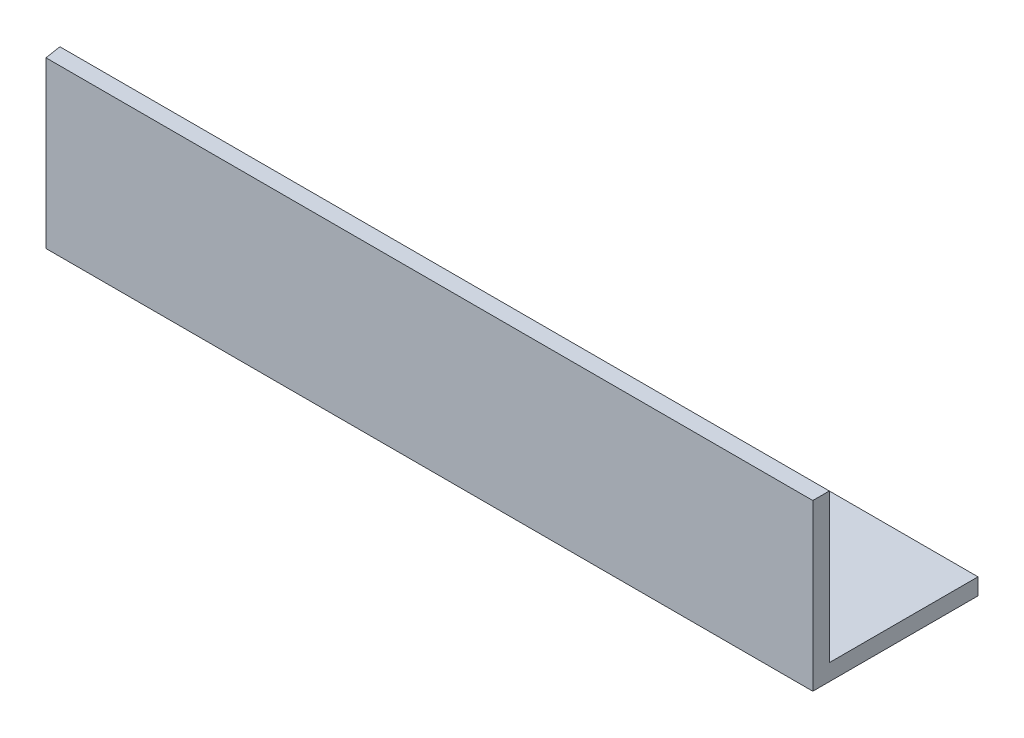
ISO-10303-21;
HEADER;
FILE_DESCRIPTION(('STEP AP214'),'2;1');
FILE_NAME('part.step','',(''),(''),'','','');
FILE_SCHEMA(('AUTOMOTIVE_DESIGN { 1 0 10303 214 1 1 1 1 }'));
ENDSEC;
DATA;
#1=APPLICATION_CONTEXT('core data for automotive mechanical design processes');
#2=APPLICATION_PROTOCOL_DEFINITION('international standard','automotive_design',2000,#1);
#3=PRODUCT_CONTEXT('',#1,'mechanical');
#4=PRODUCT('Part','Part','',(#3));
#5=PRODUCT_RELATED_PRODUCT_CATEGORY('part','',(#4));
#6=PRODUCT_DEFINITION_FORMATION('','',#4);
#7=PRODUCT_DEFINITION_CONTEXT('part definition',#1,'design');
#8=PRODUCT_DEFINITION('design','',#6,#7);
#9=PRODUCT_DEFINITION_SHAPE('','',#8);
#10=(LENGTH_UNIT() NAMED_UNIT(*) SI_UNIT(.MILLI.,.METRE.));
#11=(NAMED_UNIT(*) PLANE_ANGLE_UNIT() SI_UNIT($,.RADIAN.));
#12=(NAMED_UNIT(*) SI_UNIT($,.STERADIAN.) SOLID_ANGLE_UNIT());
#13=UNCERTAINTY_MEASURE_WITH_UNIT(LENGTH_MEASURE(1.E-05),#10,'distance_accuracy_value','');
#14=(GEOMETRIC_REPRESENTATION_CONTEXT(3) GLOBAL_UNCERTAINTY_ASSIGNED_CONTEXT((#13)) GLOBAL_UNIT_ASSIGNED_CONTEXT((#10,
#11,#12)) REPRESENTATION_CONTEXT('',''));
#15=CARTESIAN_POINT('',(0.,0.,0.));
#16=DIRECTION('',(0.,0.,1.));
#17=DIRECTION('',(1.,0.,0.));
#18=AXIS2_PLACEMENT_3D('',#15,#16,#17);
#19=CARTESIAN_POINT('',(96.,20.,0.));
#20=DIRECTION('',(0.,-1.,0.));
#21=DIRECTION('',(0.,0.,-1.));
#22=AXIS2_PLACEMENT_3D('',#19,#20,#21);
#23=PLANE('',#22);
#24=DIRECTION('',(-0.156434465040231,0.,-0.987688340595138));
#25=VECTOR('',#24,1.);
#26=CARTESIAN_POINT('',(0.,20.,-20.));
#27=LINE('',#26,#25);
#28=CARTESIAN_POINT('',(3.16768880649074,20.,0.));
#29=VERTEX_POINT('',#28);
#30=CARTESIAN_POINT('',(2.85091992584166,20.,-2.));
#31=VERTEX_POINT('',#30);
#32=EDGE_CURVE('E90',#29,#31,#27,.T.);
#33=ORIENTED_EDGE('',*,*,#32,.F.);
#34=DIRECTION('',(-1.,0.,0.));
#35=VECTOR('',#34,1.);
#36=CARTESIAN_POINT('',(96.,20.,0.));
#37=LINE('',#36,#35);
#38=CARTESIAN_POINT('',(96.,20.,0.));
#39=VERTEX_POINT('',#38);
#40=EDGE_CURVE('E11',#39,#29,#37,.T.);
#41=ORIENTED_EDGE('',*,*,#40,.F.);
#42=DIRECTION('',(0.,0.,1.));
#43=VECTOR('',#42,1.);
#44=CARTESIAN_POINT('',(96.,20.,0.));
#45=LINE('',#44,#43);
#46=CARTESIAN_POINT('',(96.,20.,-2.));
#47=VERTEX_POINT('',#46);
#48=EDGE_CURVE('E109',#47,#39,#45,.T.);
#49=ORIENTED_EDGE('',*,*,#48,.F.);
#50=DIRECTION('',(-1.,0.,0.));
#51=VECTOR('',#50,1.);
#52=CARTESIAN_POINT('',(96.,20.,-2.));
#53=LINE('',#52,#51);
#54=EDGE_CURVE('E103',#47,#31,#53,.T.);
#55=ORIENTED_EDGE('',*,*,#54,.T.);
#56=EDGE_LOOP('',(#33,#41,#49,#55));
#57=FACE_BOUND('',#56,.T.);
#58=ADVANCED_FACE('F39',(#57),#23,.F.);
#59=CARTESIAN_POINT('',(96.,20.,0.));
#60=DIRECTION('',(0.,0.,-1.));
#61=DIRECTION('',(-1.,0.,0.));
#62=AXIS2_PLACEMENT_3D('',#59,#60,#61);
#63=PLANE('',#62);
#64=DIRECTION('',(0.,-1.,0.));
#65=VECTOR('',#64,1.);
#66=CARTESIAN_POINT('',(3.16768880649074,20.,0.));
#67=LINE('',#66,#65);
#68=CARTESIAN_POINT('',(3.16768880649074,0.,0.));
#69=VERTEX_POINT('',#68);
#70=EDGE_CURVE('E86',#29,#69,#67,.T.);
#71=ORIENTED_EDGE('',*,*,#70,.T.);
#72=DIRECTION('',(-1.,0.,0.));
#73=VECTOR('',#72,1.);
#74=CARTESIAN_POINT('',(96.,0.,0.));
#75=LINE('',#74,#73);
#76=CARTESIAN_POINT('',(96.,0.,0.));
#77=VERTEX_POINT('',#76);
#78=EDGE_CURVE('E47',#77,#69,#75,.T.);
#79=ORIENTED_EDGE('',*,*,#78,.F.);
#80=DIRECTION('',(0.,-1.,0.));
#81=VECTOR('',#80,1.);
#82=CARTESIAN_POINT('',(96.,20.,0.));
#83=LINE('',#82,#81);
#84=EDGE_CURVE('E106',#39,#77,#83,.T.);
#85=ORIENTED_EDGE('',*,*,#84,.F.);
#86=ORIENTED_EDGE('',*,*,#40,.T.);
#87=EDGE_LOOP('',(#71,#79,#85,#86));
#88=FACE_BOUND('',#87,.T.);
#89=ADVANCED_FACE('F105',(#88),#63,.F.);
#90=CARTESIAN_POINT('',(96.,0.,0.));
#91=DIRECTION('',(0.,1.,0.));
#92=DIRECTION('',(0.,0.,1.));
#93=AXIS2_PLACEMENT_3D('',#90,#91,#92);
#94=PLANE('',#93);
#95=DIRECTION('',(-0.156434465040231,0.,-0.987688340595138));
#96=VECTOR('',#95,1.);
#97=CARTESIAN_POINT('',(0.,0.,-20.));
#98=LINE('',#97,#96);
#99=CARTESIAN_POINT('',(0.,0.,-20.));
#100=VERTEX_POINT('',#99);
#101=EDGE_CURVE('E93',#69,#100,#98,.T.);
#102=ORIENTED_EDGE('',*,*,#101,.T.);
#103=DIRECTION('',(-1.,0.,0.));
#104=VECTOR('',#103,1.);
#105=CARTESIAN_POINT('',(96.,0.,-20.));
#106=LINE('',#105,#104);
#107=CARTESIAN_POINT('',(96.,0.,-20.));
#108=VERTEX_POINT('',#107);
#109=EDGE_CURVE('E133',#108,#100,#106,.T.);
#110=ORIENTED_EDGE('',*,*,#109,.F.);
#111=DIRECTION('',(0.,0.,-1.));
#112=VECTOR('',#111,1.);
#113=CARTESIAN_POINT('',(96.,0.,0.));
#114=LINE('',#113,#112);
#115=EDGE_CURVE('E108',#77,#108,#114,.T.);
#116=ORIENTED_EDGE('',*,*,#115,.F.);
#117=ORIENTED_EDGE('',*,*,#78,.T.);
#118=EDGE_LOOP('',(#102,#110,#116,#117));
#119=FACE_BOUND('',#118,.T.);
#120=ADVANCED_FACE('F136',(#119),#94,.F.);
#121=CARTESIAN_POINT('',(96.,2.,-20.));
#122=DIRECTION('',(0.,-1.,0.));
#123=DIRECTION('',(0.,0.,-1.));
#124=AXIS2_PLACEMENT_3D('',#121,#122,#123);
#125=PLANE('',#124);
#126=DIRECTION('',(-0.156434465040231,0.,-0.987688340595138));
#127=VECTOR('',#126,1.);
#128=CARTESIAN_POINT('',(2.34928721783265,2.,-5.16718427000247));
#129=LINE('',#128,#127);
#130=CARTESIAN_POINT('',(2.85091992584167,2.,-2.));
#131=VERTEX_POINT('',#130);
#132=CARTESIAN_POINT('',(0.,2.,-20.));
#133=VERTEX_POINT('',#132);
#134=EDGE_CURVE('E115',#131,#133,#129,.T.);
#135=ORIENTED_EDGE('',*,*,#134,.F.);
#136=DIRECTION('',(-1.,0.,0.));
#137=VECTOR('',#136,1.);
#138=CARTESIAN_POINT('',(96.,2.,-2.));
#139=LINE('',#138,#137);
#140=CARTESIAN_POINT('',(96.,2.,-2.));
#141=VERTEX_POINT('',#140);
#142=EDGE_CURVE('E127',#141,#131,#139,.T.);
#143=ORIENTED_EDGE('',*,*,#142,.F.);
#144=DIRECTION('',(0.,0.,1.));
#145=VECTOR('',#144,1.);
#146=CARTESIAN_POINT('',(96.,2.,-20.));
#147=LINE('',#146,#145);
#148=CARTESIAN_POINT('',(96.,2.,-20.));
#149=VERTEX_POINT('',#148);
#150=EDGE_CURVE('E123',#149,#141,#147,.T.);
#151=ORIENTED_EDGE('',*,*,#150,.F.);
#152=DIRECTION('',(-1.,0.,0.));
#153=VECTOR('',#152,1.);
#154=CARTESIAN_POINT('',(96.,2.,-20.));
#155=LINE('',#154,#153);
#156=EDGE_CURVE('E130',#149,#133,#155,.T.);
#157=ORIENTED_EDGE('',*,*,#156,.T.);
#158=EDGE_LOOP('',(#135,#143,#151,#157));
#159=FACE_BOUND('',#158,.T.);
#160=ADVANCED_FACE('F146',(#159),#125,.F.);
#161=CARTESIAN_POINT('',(96.,2.,-2.));
#162=DIRECTION('',(0.,0.,1.));
#163=DIRECTION('',(0.,-1.,0.));
#164=AXIS2_PLACEMENT_3D('',#161,#162,#163);
#165=PLANE('',#164);
#166=DIRECTION('',(0.,-1.,0.));
#167=VECTOR('',#166,1.);
#168=CARTESIAN_POINT('',(2.85091992584167,2.,-2.));
#169=LINE('',#168,#167);
#170=EDGE_CURVE('E97',#31,#131,#169,.T.);
#171=ORIENTED_EDGE('',*,*,#170,.F.);
#172=ORIENTED_EDGE('',*,*,#54,.F.);
#173=DIRECTION('',(0.,1.,0.));
#174=VECTOR('',#173,1.);
#175=CARTESIAN_POINT('',(96.,2.,-2.));
#176=LINE('',#175,#174);
#177=EDGE_CURVE('E54',#141,#47,#176,.T.);
#178=ORIENTED_EDGE('',*,*,#177,.F.);
#179=ORIENTED_EDGE('',*,*,#142,.T.);
#180=EDGE_LOOP('',(#171,#172,#178,#179));
#181=FACE_BOUND('',#180,.T.);
#182=ADVANCED_FACE('F148',(#181),#165,.F.);
#183=CARTESIAN_POINT('',(96.,0.,-20.));
#184=DIRECTION('',(0.,0.,1.));
#185=DIRECTION('',(1.,0.,0.));
#186=AXIS2_PLACEMENT_3D('',#183,#184,#185);
#187=PLANE('',#186);
#188=DIRECTION('',(0.,1.,0.));
#189=VECTOR('',#188,1.);
#190=CARTESIAN_POINT('',(0.,0.,-20.));
#191=LINE('',#190,#189);
#192=EDGE_CURVE('E112',#100,#133,#191,.T.);
#193=ORIENTED_EDGE('',*,*,#192,.T.);
#194=ORIENTED_EDGE('',*,*,#156,.F.);
#195=DIRECTION('',(0.,1.,0.));
#196=VECTOR('',#195,1.);
#197=CARTESIAN_POINT('',(96.,0.,-20.));
#198=LINE('',#197,#196);
#199=EDGE_CURVE('E121',#108,#149,#198,.T.);
#200=ORIENTED_EDGE('',*,*,#199,.F.);
#201=ORIENTED_EDGE('',*,*,#109,.T.);
#202=EDGE_LOOP('',(#193,#194,#200,#201));
#203=FACE_BOUND('',#202,.T.);
#204=ADVANCED_FACE('F143',(#203),#187,.F.);
#205=CARTESIAN_POINT('',(96.,0.,0.));
#206=DIRECTION('',(1.,0.,0.));
#207=DIRECTION('',(0.,0.,-1.));
#208=AXIS2_PLACEMENT_3D('',#205,#206,#207);
#209=PLANE('',#208);
#210=ORIENTED_EDGE('',*,*,#48,.T.);
#211=ORIENTED_EDGE('',*,*,#84,.T.);
#212=ORIENTED_EDGE('',*,*,#115,.T.);
#213=ORIENTED_EDGE('',*,*,#199,.T.);
#214=ORIENTED_EDGE('',*,*,#150,.T.);
#215=ORIENTED_EDGE('',*,*,#177,.T.);
#216=EDGE_LOOP('',(#210,#211,#212,#213,#214,#215));
#217=FACE_BOUND('',#216,.T.);
#218=ADVANCED_FACE('F111',(#217),#209,.T.);
#219=CARTESIAN_POINT('',(0.,20.,-20.));
#220=DIRECTION('',(-0.987688340595138,0.,0.156434465040231));
#221=DIRECTION('',(0.156434465040231,0.,0.987688340595138));
#222=AXIS2_PLACEMENT_3D('',#219,#220,#221);
#223=PLANE('',#222);
#224=ORIENTED_EDGE('',*,*,#134,.T.);
#225=ORIENTED_EDGE('',*,*,#192,.F.);
#226=ORIENTED_EDGE('',*,*,#101,.F.);
#227=ORIENTED_EDGE('',*,*,#70,.F.);
#228=ORIENTED_EDGE('',*,*,#32,.T.);
#229=ORIENTED_EDGE('',*,*,#170,.T.);
#230=EDGE_LOOP('',(#224,#225,#226,#227,#228,#229));
#231=FACE_BOUND('',#230,.T.);
#232=ADVANCED_FACE('F89',(#231),#223,.T.);
#233=CLOSED_SHELL('',(#58,#89,#120,#160,#182,#204,#218,#232));
#234=MANIFOLD_SOLID_BREP('B2',#233);
#235=ADVANCED_BREP_SHAPE_REPRESENTATION('',(#18,#234),#14);
#236=SHAPE_DEFINITION_REPRESENTATION(#9,#235);
ENDSEC;
END-ISO-10303-21;
